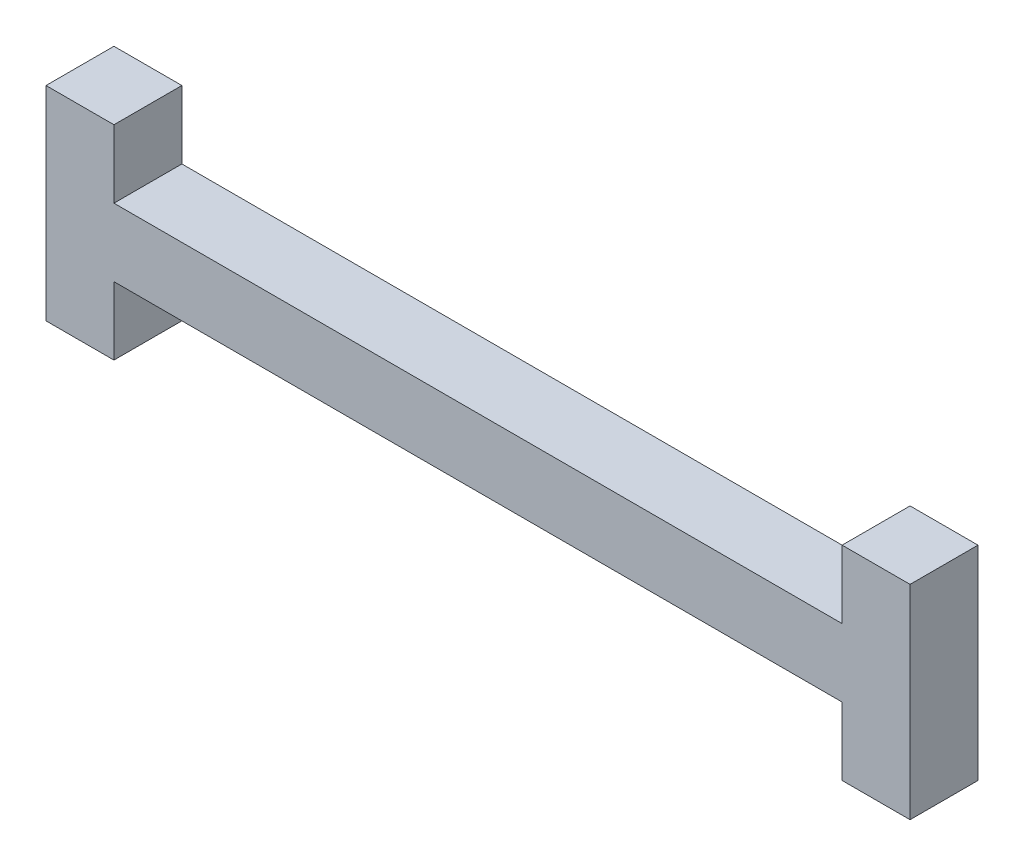
ISO-10303-21;
HEADER;
FILE_DESCRIPTION(('STEP AP214'),'2;1');
FILE_NAME('part.step','',(''),(''),'','','');
FILE_SCHEMA(('AUTOMOTIVE_DESIGN { 1 0 10303 214 1 1 1 1 }'));
ENDSEC;
DATA;
#1=APPLICATION_CONTEXT('core data for automotive mechanical design processes');
#2=APPLICATION_PROTOCOL_DEFINITION('international standard','automotive_design',2000,#1);
#3=PRODUCT_CONTEXT('',#1,'mechanical');
#4=PRODUCT('Part','Part','',(#3));
#5=PRODUCT_RELATED_PRODUCT_CATEGORY('part','',(#4));
#6=PRODUCT_DEFINITION_FORMATION('','',#4);
#7=PRODUCT_DEFINITION_CONTEXT('part definition',#1,'design');
#8=PRODUCT_DEFINITION('design','',#6,#7);
#9=PRODUCT_DEFINITION_SHAPE('','',#8);
#10=(LENGTH_UNIT() NAMED_UNIT(*) SI_UNIT(.MILLI.,.METRE.));
#11=(NAMED_UNIT(*) PLANE_ANGLE_UNIT() SI_UNIT($,.RADIAN.));
#12=(NAMED_UNIT(*) SI_UNIT($,.STERADIAN.) SOLID_ANGLE_UNIT());
#13=UNCERTAINTY_MEASURE_WITH_UNIT(LENGTH_MEASURE(1.E-05),#10,'distance_accuracy_value','');
#14=(GEOMETRIC_REPRESENTATION_CONTEXT(3) GLOBAL_UNCERTAINTY_ASSIGNED_CONTEXT((#13)) GLOBAL_UNIT_ASSIGNED_CONTEXT((#10,
#11,#12)) REPRESENTATION_CONTEXT('',''));
#15=CARTESIAN_POINT('',(0.,0.,0.));
#16=DIRECTION('',(0.,0.,1.));
#17=DIRECTION('',(1.,0.,0.));
#18=AXIS2_PLACEMENT_3D('',#15,#16,#17);
#19=CARTESIAN_POINT('',(5.00000000000001,0.,5.));
#20=DIRECTION('',(0.,-1.,0.));
#21=DIRECTION('',(1.,0.,0.));
#22=AXIS2_PLACEMENT_3D('',#19,#20,#21);
#23=PLANE('',#22);
#24=DIRECTION('',(-1.,0.,0.));
#25=VECTOR('',#24,1.);
#26=CARTESIAN_POINT('',(5.00000000000001,0.,0.));
#27=LINE('',#26,#25);
#28=CARTESIAN_POINT('',(5.00000000000001,0.,0.));
#29=VERTEX_POINT('',#28);
#30=CARTESIAN_POINT('',(0.,0.,0.));
#31=VERTEX_POINT('',#30);
#32=EDGE_CURVE('E159',#29,#31,#27,.T.);
#33=ORIENTED_EDGE('',*,*,#32,.T.);
#34=DIRECTION('',(0.,0.,-1.));
#35=VECTOR('',#34,1.);
#36=CARTESIAN_POINT('',(0.,0.,5.));
#37=LINE('',#36,#35);
#38=CARTESIAN_POINT('',(0.,0.,5.));
#39=VERTEX_POINT('',#38);
#40=EDGE_CURVE('E11',#39,#31,#37,.T.);
#41=ORIENTED_EDGE('',*,*,#40,.F.);
#42=DIRECTION('',(-1.,0.,0.));
#43=VECTOR('',#42,1.);
#44=CARTESIAN_POINT('',(5.00000000000001,0.,5.));
#45=LINE('',#44,#43);
#46=CARTESIAN_POINT('',(5.00000000000001,0.,5.));
#47=VERTEX_POINT('',#46);
#48=EDGE_CURVE('E181',#47,#39,#45,.T.);
#49=ORIENTED_EDGE('',*,*,#48,.F.);
#50=DIRECTION('',(0.,0.,-1.));
#51=VECTOR('',#50,1.);
#52=CARTESIAN_POINT('',(5.00000000000001,0.,5.));
#53=LINE('',#52,#51);
#54=EDGE_CURVE('E155',#47,#29,#53,.T.);
#55=ORIENTED_EDGE('',*,*,#54,.T.);
#56=EDGE_LOOP('',(#33,#41,#49,#55));
#57=FACE_BOUND('',#56,.T.);
#58=ADVANCED_FACE('F39',(#57),#23,.F.);
#59=CARTESIAN_POINT('',(0.,0.,5.));
#60=DIRECTION('',(1.,0.,0.));
#61=DIRECTION('',(0.,1.,0.));
#62=AXIS2_PLACEMENT_3D('',#59,#60,#61);
#63=PLANE('',#62);
#64=DIRECTION('',(0.,-1.,0.));
#65=VECTOR('',#64,1.);
#66=CARTESIAN_POINT('',(0.,0.,0.));
#67=LINE('',#66,#65);
#68=CARTESIAN_POINT('',(0.,-15.,0.));
#69=VERTEX_POINT('',#68);
#70=EDGE_CURVE('E162',#31,#69,#67,.T.);
#71=ORIENTED_EDGE('',*,*,#70,.T.);
#72=DIRECTION('',(0.,0.,-1.));
#73=VECTOR('',#72,1.);
#74=CARTESIAN_POINT('',(0.,-15.,5.));
#75=LINE('',#74,#73);
#76=CARTESIAN_POINT('',(0.,-15.,5.));
#77=VERTEX_POINT('',#76);
#78=EDGE_CURVE('E47',#77,#69,#75,.T.);
#79=ORIENTED_EDGE('',*,*,#78,.F.);
#80=DIRECTION('',(0.,-1.,0.));
#81=VECTOR('',#80,1.);
#82=CARTESIAN_POINT('',(0.,0.,5.));
#83=LINE('',#82,#81);
#84=EDGE_CURVE('E110',#39,#77,#83,.T.);
#85=ORIENTED_EDGE('',*,*,#84,.F.);
#86=ORIENTED_EDGE('',*,*,#40,.T.);
#87=EDGE_LOOP('',(#71,#79,#85,#86));
#88=FACE_BOUND('',#87,.T.);
#89=ADVANCED_FACE('F259',(#88),#63,.F.);
#90=CARTESIAN_POINT('',(0.,-15.,5.));
#91=DIRECTION('',(0.,1.,0.));
#92=DIRECTION('',(-1.,0.,0.));
#93=AXIS2_PLACEMENT_3D('',#90,#91,#92);
#94=PLANE('',#93);
#95=DIRECTION('',(1.,0.,0.));
#96=VECTOR('',#95,1.);
#97=CARTESIAN_POINT('',(0.,-15.,0.));
#98=LINE('',#97,#96);
#99=CARTESIAN_POINT('',(5.,-15.,0.));
#100=VERTEX_POINT('',#99);
#101=EDGE_CURVE('E164',#69,#100,#98,.T.);
#102=ORIENTED_EDGE('',*,*,#101,.T.);
#103=DIRECTION('',(0.,0.,-1.));
#104=VECTOR('',#103,1.);
#105=CARTESIAN_POINT('',(5.,-15.,5.));
#106=LINE('',#105,#104);
#107=CARTESIAN_POINT('',(5.,-15.,5.));
#108=VERTEX_POINT('',#107);
#109=EDGE_CURVE('E200',#108,#100,#106,.T.);
#110=ORIENTED_EDGE('',*,*,#109,.F.);
#111=DIRECTION('',(1.,0.,0.));
#112=VECTOR('',#111,1.);
#113=CARTESIAN_POINT('',(0.,-15.,5.));
#114=LINE('',#113,#112);
#115=EDGE_CURVE('E208',#77,#108,#114,.T.);
#116=ORIENTED_EDGE('',*,*,#115,.F.);
#117=ORIENTED_EDGE('',*,*,#78,.T.);
#118=EDGE_LOOP('',(#102,#110,#116,#117));
#119=FACE_BOUND('',#118,.T.);
#120=ADVANCED_FACE('F206',(#119),#94,.F.);
#121=CARTESIAN_POINT('',(5.,-15.,5.));
#122=DIRECTION('',(-1.,0.,0.));
#123=DIRECTION('',(0.,0.,1.));
#124=AXIS2_PLACEMENT_3D('',#121,#122,#123);
#125=PLANE('',#124);
#126=DIRECTION('',(0.,1.,0.));
#127=VECTOR('',#126,1.);
#128=CARTESIAN_POINT('',(5.,-15.,0.));
#129=LINE('',#128,#127);
#130=CARTESIAN_POINT('',(5.,-9.99999999999999,0.));
#131=VERTEX_POINT('',#130);
#132=EDGE_CURVE('E166',#100,#131,#129,.T.);
#133=ORIENTED_EDGE('',*,*,#132,.T.);
#134=DIRECTION('',(0.,0.,-1.));
#135=VECTOR('',#134,1.);
#136=CARTESIAN_POINT('',(5.,-9.99999999999999,5.));
#137=LINE('',#136,#135);
#138=CARTESIAN_POINT('',(5.,-9.99999999999999,5.));
#139=VERTEX_POINT('',#138);
#140=EDGE_CURVE('E197',#139,#131,#137,.T.);
#141=ORIENTED_EDGE('',*,*,#140,.F.);
#142=DIRECTION('',(0.,1.,0.));
#143=VECTOR('',#142,1.);
#144=CARTESIAN_POINT('',(5.,-15.,5.));
#145=LINE('',#144,#143);
#146=EDGE_CURVE('E226',#108,#139,#145,.T.);
#147=ORIENTED_EDGE('',*,*,#146,.F.);
#148=ORIENTED_EDGE('',*,*,#109,.T.);
#149=EDGE_LOOP('',(#133,#141,#147,#148));
#150=FACE_BOUND('',#149,.T.);
#151=ADVANCED_FACE('F217',(#150),#125,.F.);
#152=CARTESIAN_POINT('',(5.,-9.99999999999999,5.));
#153=DIRECTION('',(0.,1.,0.));
#154=DIRECTION('',(-1.,0.,0.));
#155=AXIS2_PLACEMENT_3D('',#152,#153,#154);
#156=PLANE('',#155);
#157=DIRECTION('',(1.,0.,0.));
#158=VECTOR('',#157,1.);
#159=CARTESIAN_POINT('',(5.,-9.99999999999999,0.));
#160=LINE('',#159,#158);
#161=CARTESIAN_POINT('',(58.585,-9.99999999999999,0.));
#162=VERTEX_POINT('',#161);
#163=EDGE_CURVE('E168',#131,#162,#160,.T.);
#164=ORIENTED_EDGE('',*,*,#163,.T.);
#165=DIRECTION('',(0.,0.,-1.));
#166=VECTOR('',#165,1.);
#167=CARTESIAN_POINT('',(58.585,-9.99999999999999,5.));
#168=LINE('',#167,#166);
#169=CARTESIAN_POINT('',(58.585,-9.99999999999999,5.));
#170=VERTEX_POINT('',#169);
#171=EDGE_CURVE('E194',#170,#162,#168,.T.);
#172=ORIENTED_EDGE('',*,*,#171,.F.);
#173=DIRECTION('',(1.,0.,0.));
#174=VECTOR('',#173,1.);
#175=CARTESIAN_POINT('',(5.,-9.99999999999999,5.));
#176=LINE('',#175,#174);
#177=EDGE_CURVE('E223',#139,#170,#176,.T.);
#178=ORIENTED_EDGE('',*,*,#177,.F.);
#179=ORIENTED_EDGE('',*,*,#140,.T.);
#180=EDGE_LOOP('',(#164,#172,#178,#179));
#181=FACE_BOUND('',#180,.T.);
#182=ADVANCED_FACE('F221',(#181),#156,.F.);
#183=CARTESIAN_POINT('',(58.585,-9.99999999999999,5.));
#184=DIRECTION('',(1.,0.,0.));
#185=DIRECTION('',(0.,1.,0.));
#186=AXIS2_PLACEMENT_3D('',#183,#184,#185);
#187=PLANE('',#186);
#188=DIRECTION('',(0.,-1.,0.));
#189=VECTOR('',#188,1.);
#190=CARTESIAN_POINT('',(58.585,-9.99999999999999,0.));
#191=LINE('',#190,#189);
#192=CARTESIAN_POINT('',(58.585,-15.,0.));
#193=VERTEX_POINT('',#192);
#194=EDGE_CURVE('E170',#162,#193,#191,.T.);
#195=ORIENTED_EDGE('',*,*,#194,.T.);
#196=DIRECTION('',(0.,0.,-1.));
#197=VECTOR('',#196,1.);
#198=CARTESIAN_POINT('',(58.585,-15.,5.));
#199=LINE('',#198,#197);
#200=CARTESIAN_POINT('',(58.585,-15.,5.));
#201=VERTEX_POINT('',#200);
#202=EDGE_CURVE('E191',#201,#193,#199,.T.);
#203=ORIENTED_EDGE('',*,*,#202,.F.);
#204=DIRECTION('',(0.,-1.,0.));
#205=VECTOR('',#204,1.);
#206=CARTESIAN_POINT('',(58.585,-9.99999999999999,5.));
#207=LINE('',#206,#205);
#208=EDGE_CURVE('E225',#170,#201,#207,.T.);
#209=ORIENTED_EDGE('',*,*,#208,.F.);
#210=ORIENTED_EDGE('',*,*,#171,.T.);
#211=EDGE_LOOP('',(#195,#203,#209,#210));
#212=FACE_BOUND('',#211,.T.);
#213=ADVANCED_FACE('F272',(#212),#187,.F.);
#214=CARTESIAN_POINT('',(58.585,-15.,5.));
#215=DIRECTION('',(0.,1.,0.));
#216=DIRECTION('',(0.,0.,1.));
#217=AXIS2_PLACEMENT_3D('',#214,#215,#216);
#218=PLANE('',#217);
#219=DIRECTION('',(1.,0.,0.));
#220=VECTOR('',#219,1.);
#221=CARTESIAN_POINT('',(58.585,-15.,0.));
#222=LINE('',#221,#220);
#223=CARTESIAN_POINT('',(63.585,-15.,0.));
#224=VERTEX_POINT('',#223);
#225=EDGE_CURVE('E172',#193,#224,#222,.T.);
#226=ORIENTED_EDGE('',*,*,#225,.T.);
#227=DIRECTION('',(0.,0.,-1.));
#228=VECTOR('',#227,1.);
#229=CARTESIAN_POINT('',(63.585,-15.,5.));
#230=LINE('',#229,#228);
#231=CARTESIAN_POINT('',(63.585,-15.,5.));
#232=VERTEX_POINT('',#231);
#233=EDGE_CURVE('E188',#232,#224,#230,.T.);
#234=ORIENTED_EDGE('',*,*,#233,.F.);
#235=DIRECTION('',(1.,0.,0.));
#236=VECTOR('',#235,1.);
#237=CARTESIAN_POINT('',(58.585,-15.,5.));
#238=LINE('',#237,#236);
#239=EDGE_CURVE('E228',#201,#232,#238,.T.);
#240=ORIENTED_EDGE('',*,*,#239,.F.);
#241=ORIENTED_EDGE('',*,*,#202,.T.);
#242=EDGE_LOOP('',(#226,#234,#240,#241));
#243=FACE_BOUND('',#242,.T.);
#244=ADVANCED_FACE('F275',(#243),#218,.F.);
#245=CARTESIAN_POINT('',(63.585,-15.,5.));
#246=DIRECTION('',(-1.,0.,0.));
#247=DIRECTION('',(0.,0.,1.));
#248=AXIS2_PLACEMENT_3D('',#245,#246,#247);
#249=PLANE('',#248);
#250=DIRECTION('',(0.,1.,0.));
#251=VECTOR('',#250,1.);
#252=CARTESIAN_POINT('',(63.585,-15.,0.));
#253=LINE('',#252,#251);
#254=CARTESIAN_POINT('',(63.585,0.,0.));
#255=VERTEX_POINT('',#254);
#256=EDGE_CURVE('E174',#224,#255,#253,.T.);
#257=ORIENTED_EDGE('',*,*,#256,.T.);
#258=DIRECTION('',(0.,0.,-1.));
#259=VECTOR('',#258,1.);
#260=CARTESIAN_POINT('',(63.585,0.,5.));
#261=LINE('',#260,#259);
#262=CARTESIAN_POINT('',(63.585,0.,5.));
#263=VERTEX_POINT('',#262);
#264=EDGE_CURVE('E185',#263,#255,#261,.T.);
#265=ORIENTED_EDGE('',*,*,#264,.F.);
#266=DIRECTION('',(0.,1.,0.));
#267=VECTOR('',#266,1.);
#268=CARTESIAN_POINT('',(63.585,-15.,5.));
#269=LINE('',#268,#267);
#270=EDGE_CURVE('E234',#232,#263,#269,.T.);
#271=ORIENTED_EDGE('',*,*,#270,.F.);
#272=ORIENTED_EDGE('',*,*,#233,.T.);
#273=EDGE_LOOP('',(#257,#265,#271,#272));
#274=FACE_BOUND('',#273,.T.);
#275=ADVANCED_FACE('F240',(#274),#249,.F.);
#276=CARTESIAN_POINT('',(63.585,0.,5.));
#277=DIRECTION('',(0.,-1.,0.));
#278=DIRECTION('',(1.,0.,0.));
#279=AXIS2_PLACEMENT_3D('',#276,#277,#278);
#280=PLANE('',#279);
#281=DIRECTION('',(-1.,0.,0.));
#282=VECTOR('',#281,1.);
#283=CARTESIAN_POINT('',(63.585,0.,0.));
#284=LINE('',#283,#282);
#285=CARTESIAN_POINT('',(58.585,0.,0.));
#286=VERTEX_POINT('',#285);
#287=EDGE_CURVE('E176',#255,#286,#284,.T.);
#288=ORIENTED_EDGE('',*,*,#287,.T.);
#289=DIRECTION('',(0.,0.,-1.));
#290=VECTOR('',#289,1.);
#291=CARTESIAN_POINT('',(58.585,0.,5.));
#292=LINE('',#291,#290);
#293=CARTESIAN_POINT('',(58.585,0.,5.));
#294=VERTEX_POINT('',#293);
#295=EDGE_CURVE('E150',#294,#286,#292,.T.);
#296=ORIENTED_EDGE('',*,*,#295,.F.);
#297=DIRECTION('',(-1.,0.,0.));
#298=VECTOR('',#297,1.);
#299=CARTESIAN_POINT('',(63.585,0.,5.));
#300=LINE('',#299,#298);
#301=EDGE_CURVE('E141',#263,#294,#300,.T.);
#302=ORIENTED_EDGE('',*,*,#301,.F.);
#303=ORIENTED_EDGE('',*,*,#264,.T.);
#304=EDGE_LOOP('',(#288,#296,#302,#303));
#305=FACE_BOUND('',#304,.T.);
#306=ADVANCED_FACE('F244',(#305),#280,.F.);
#307=CARTESIAN_POINT('',(58.585,0.,5.));
#308=DIRECTION('',(1.,0.,0.));
#309=DIRECTION('',(0.,0.,-1.));
#310=AXIS2_PLACEMENT_3D('',#307,#308,#309);
#311=PLANE('',#310);
#312=DIRECTION('',(0.,-1.,0.));
#313=VECTOR('',#312,1.);
#314=CARTESIAN_POINT('',(58.585,0.,0.));
#315=LINE('',#314,#313);
#316=CARTESIAN_POINT('',(58.585,-4.99999999999999,0.));
#317=VERTEX_POINT('',#316);
#318=EDGE_CURVE('E149',#286,#317,#315,.T.);
#319=ORIENTED_EDGE('',*,*,#318,.T.);
#320=DIRECTION('',(0.,0.,-1.));
#321=VECTOR('',#320,1.);
#322=CARTESIAN_POINT('',(58.585,-4.99999999999999,5.));
#323=LINE('',#322,#321);
#324=CARTESIAN_POINT('',(58.585,-4.99999999999999,5.));
#325=VERTEX_POINT('',#324);
#326=EDGE_CURVE('E146',#325,#317,#323,.T.);
#327=ORIENTED_EDGE('',*,*,#326,.F.);
#328=DIRECTION('',(0.,-1.,0.));
#329=VECTOR('',#328,1.);
#330=CARTESIAN_POINT('',(58.585,0.,5.));
#331=LINE('',#330,#329);
#332=EDGE_CURVE('E135',#294,#325,#331,.T.);
#333=ORIENTED_EDGE('',*,*,#332,.F.);
#334=ORIENTED_EDGE('',*,*,#295,.T.);
#335=EDGE_LOOP('',(#319,#327,#333,#334));
#336=FACE_BOUND('',#335,.T.);
#337=ADVANCED_FACE('F147',(#336),#311,.F.);
#338=CARTESIAN_POINT('',(58.585,-4.99999999999999,5.));
#339=DIRECTION('',(0.,-1.,0.));
#340=DIRECTION('',(1.,0.,0.));
#341=AXIS2_PLACEMENT_3D('',#338,#339,#340);
#342=PLANE('',#341);
#343=DIRECTION('',(-1.,0.,0.));
#344=VECTOR('',#343,1.);
#345=CARTESIAN_POINT('',(58.585,-4.99999999999999,0.));
#346=LINE('',#345,#344);
#347=CARTESIAN_POINT('',(5.00000000000001,-5.,0.));
#348=VERTEX_POINT('',#347);
#349=EDGE_CURVE('E96',#317,#348,#346,.T.);
#350=ORIENTED_EDGE('',*,*,#349,.T.);
#351=DIRECTION('',(0.,0.,-1.));
#352=VECTOR('',#351,1.);
#353=CARTESIAN_POINT('',(5.00000000000001,-5.,5.));
#354=LINE('',#353,#352);
#355=CARTESIAN_POINT('',(5.00000000000001,-5.,5.));
#356=VERTEX_POINT('',#355);
#357=EDGE_CURVE('E151',#356,#348,#354,.T.);
#358=ORIENTED_EDGE('',*,*,#357,.F.);
#359=DIRECTION('',(-1.,0.,0.));
#360=VECTOR('',#359,1.);
#361=CARTESIAN_POINT('',(58.585,-4.99999999999999,5.));
#362=LINE('',#361,#360);
#363=EDGE_CURVE('E139',#325,#356,#362,.T.);
#364=ORIENTED_EDGE('',*,*,#363,.F.);
#365=ORIENTED_EDGE('',*,*,#326,.T.);
#366=EDGE_LOOP('',(#350,#358,#364,#365));
#367=FACE_BOUND('',#366,.T.);
#368=ADVANCED_FACE('F153',(#367),#342,.F.);
#369=CARTESIAN_POINT('',(5.00000000000001,-5.,5.));
#370=DIRECTION('',(-1.,0.,0.));
#371=DIRECTION('',(0.,0.,1.));
#372=AXIS2_PLACEMENT_3D('',#369,#370,#371);
#373=PLANE('',#372);
#374=DIRECTION('',(0.,1.,0.));
#375=VECTOR('',#374,1.);
#376=CARTESIAN_POINT('',(5.00000000000001,-5.,0.));
#377=LINE('',#376,#375);
#378=EDGE_CURVE('E102',#348,#29,#377,.T.);
#379=ORIENTED_EDGE('',*,*,#378,.T.);
#380=ORIENTED_EDGE('',*,*,#54,.F.);
#381=DIRECTION('',(0.,1.,0.));
#382=VECTOR('',#381,1.);
#383=CARTESIAN_POINT('',(5.00000000000001,-5.,5.));
#384=LINE('',#383,#382);
#385=EDGE_CURVE('E55',#356,#47,#384,.T.);
#386=ORIENTED_EDGE('',*,*,#385,.F.);
#387=ORIENTED_EDGE('',*,*,#357,.T.);
#388=EDGE_LOOP('',(#379,#380,#386,#387));
#389=FACE_BOUND('',#388,.T.);
#390=ADVANCED_FACE('F248',(#389),#373,.F.);
#391=CARTESIAN_POINT('',(0.,0.,5.));
#392=DIRECTION('',(0.,0.,1.));
#393=DIRECTION('',(1.,0.,0.));
#394=AXIS2_PLACEMENT_3D('',#391,#392,#393);
#395=PLANE('',#394);
#396=ORIENTED_EDGE('',*,*,#48,.T.);
#397=ORIENTED_EDGE('',*,*,#84,.T.);
#398=ORIENTED_EDGE('',*,*,#115,.T.);
#399=ORIENTED_EDGE('',*,*,#146,.T.);
#400=ORIENTED_EDGE('',*,*,#177,.T.);
#401=ORIENTED_EDGE('',*,*,#208,.T.);
#402=ORIENTED_EDGE('',*,*,#239,.T.);
#403=ORIENTED_EDGE('',*,*,#270,.T.);
#404=ORIENTED_EDGE('',*,*,#301,.T.);
#405=ORIENTED_EDGE('',*,*,#332,.T.);
#406=ORIENTED_EDGE('',*,*,#363,.T.);
#407=ORIENTED_EDGE('',*,*,#385,.T.);
#408=EDGE_LOOP('',(#396,#397,#398,#399,#400,#401,#402,#403,#404,#405,#406,#407));
#409=FACE_BOUND('',#408,.T.);
#410=ADVANCED_FACE('F137',(#409),#395,.T.);
#411=CARTESIAN_POINT('',(0.,0.,0.));
#412=DIRECTION('',(0.,0.,1.));
#413=DIRECTION('',(1.,0.,0.));
#414=AXIS2_PLACEMENT_3D('',#411,#412,#413);
#415=PLANE('',#414);
#416=ORIENTED_EDGE('',*,*,#32,.F.);
#417=ORIENTED_EDGE('',*,*,#378,.F.);
#418=ORIENTED_EDGE('',*,*,#349,.F.);
#419=ORIENTED_EDGE('',*,*,#318,.F.);
#420=ORIENTED_EDGE('',*,*,#287,.F.);
#421=ORIENTED_EDGE('',*,*,#256,.F.);
#422=ORIENTED_EDGE('',*,*,#225,.F.);
#423=ORIENTED_EDGE('',*,*,#194,.F.);
#424=ORIENTED_EDGE('',*,*,#163,.F.);
#425=ORIENTED_EDGE('',*,*,#132,.F.);
#426=ORIENTED_EDGE('',*,*,#101,.F.);
#427=ORIENTED_EDGE('',*,*,#70,.F.);
#428=EDGE_LOOP('',(#416,#417,#418,#419,#420,#421,#422,#423,#424,#425,#426,#427));
#429=FACE_BOUND('',#428,.T.);
#430=ADVANCED_FACE('F212',(#429),#415,.F.);
#431=CLOSED_SHELL('',(#58,#89,#120,#151,#182,#213,#244,#275,#306,#337,#368,#390,#410,#430));
#432=MANIFOLD_SOLID_BREP('B2',#431);
#433=ADVANCED_BREP_SHAPE_REPRESENTATION('',(#18,#432),#14);
#434=SHAPE_DEFINITION_REPRESENTATION(#9,#433);
ENDSEC;
END-ISO-10303-21;
